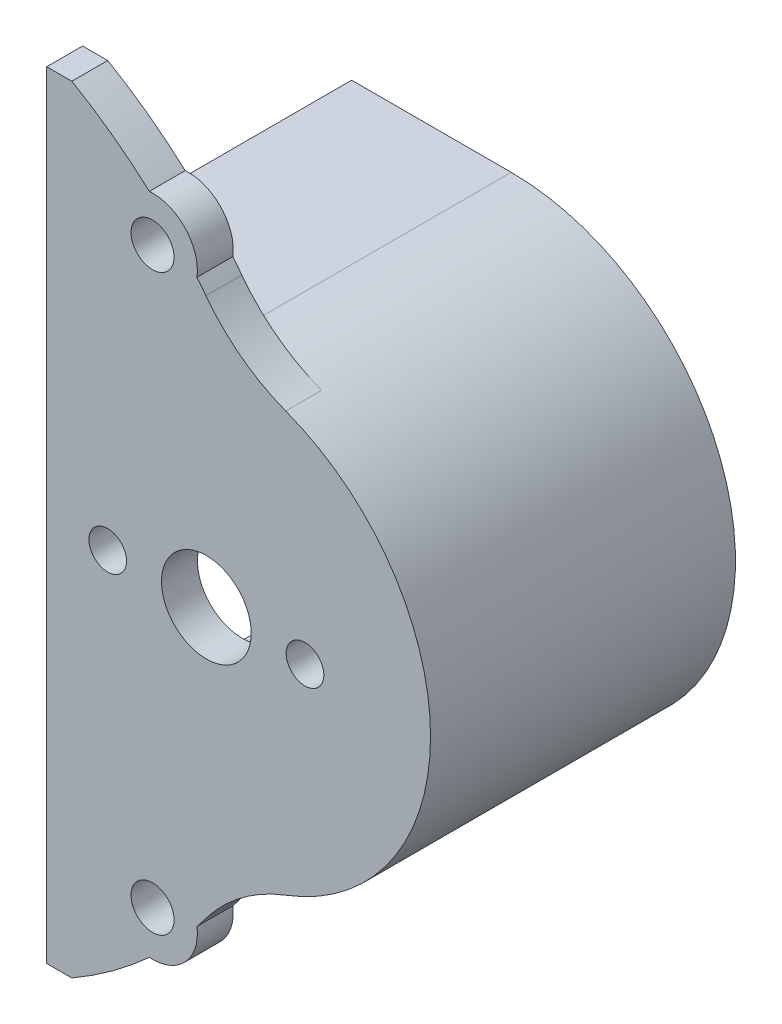
ISO-10303-21;
HEADER;
FILE_DESCRIPTION(('STEP AP214'),'2;1');
FILE_NAME('part.step','',(''),(''),'','','');
FILE_SCHEMA(('AUTOMOTIVE_DESIGN { 1 0 10303 214 1 1 1 1 }'));
ENDSEC;
DATA;
#1=APPLICATION_CONTEXT('core data for automotive mechanical design processes');
#2=APPLICATION_PROTOCOL_DEFINITION('international standard','automotive_design',2000,#1);
#3=PRODUCT_CONTEXT('',#1,'mechanical');
#4=PRODUCT('Part','Part','',(#3));
#5=PRODUCT_RELATED_PRODUCT_CATEGORY('part','',(#4));
#6=PRODUCT_DEFINITION_FORMATION('','',#4);
#7=PRODUCT_DEFINITION_CONTEXT('part definition',#1,'design');
#8=PRODUCT_DEFINITION('design','',#6,#7);
#9=PRODUCT_DEFINITION_SHAPE('','',#8);
#10=(LENGTH_UNIT() NAMED_UNIT(*) SI_UNIT(.MILLI.,.METRE.));
#11=(NAMED_UNIT(*) PLANE_ANGLE_UNIT() SI_UNIT($,.RADIAN.));
#12=(NAMED_UNIT(*) SI_UNIT($,.STERADIAN.) SOLID_ANGLE_UNIT());
#13=UNCERTAINTY_MEASURE_WITH_UNIT(LENGTH_MEASURE(1.E-05),#10,'distance_accuracy_value','');
#14=(GEOMETRIC_REPRESENTATION_CONTEXT(3) GLOBAL_UNCERTAINTY_ASSIGNED_CONTEXT((#13)) GLOBAL_UNIT_ASSIGNED_CONTEXT((#10,
#11,#12)) REPRESENTATION_CONTEXT('',''));
#15=CARTESIAN_POINT('',(0.,0.,0.));
#16=DIRECTION('',(0.,0.,1.));
#17=DIRECTION('',(1.,0.,0.));
#18=AXIS2_PLACEMENT_3D('',#15,#16,#17);
#19=CARTESIAN_POINT('',(8.6602540378444,4.99999999999998,0.));
#20=DIRECTION('',(0.,0.,1.));
#21=DIRECTION('',(1.,0.,0.));
#22=AXIS2_PLACEMENT_3D('',#19,#20,#21);
#23=PLANE('',#22);
#24=CARTESIAN_POINT('',(-3.00000000000013,4.00000000000007,0.));
#25=DIRECTION('',(0.,0.,1.));
#26=DIRECTION('',(1.,0.,0.));
#27=AXIS2_PLACEMENT_3D('',#24,#25,#26);
#28=CIRCLE('',#27,1.20000000000005);
#29=CARTESIAN_POINT('',(-1.80000000000008,4.00000000000007,0.));
#30=VERTEX_POINT('',#29);
#31=EDGE_CURVE('E322',#30,#30,#28,.T.);
#32=ORIENTED_EDGE('',*,*,#31,.T.);
#33=EDGE_LOOP('',(#32));
#34=FACE_BOUND('',#33,.T.);
#35=DIRECTION('',(-1.,0.,0.));
#36=VECTOR('',#35,1.);
#37=CARTESIAN_POINT('',(0.,7.5,0.));
#38=LINE('',#37,#36);
#39=CARTESIAN_POINT('',(0.,7.5,0.));
#40=VERTEX_POINT('',#39);
#41=CARTESIAN_POINT('',(-8.9,7.5,0.));
#42=VERTEX_POINT('',#41);
#43=EDGE_CURVE('E199',#40,#42,#38,.T.);
#44=ORIENTED_EDGE('',*,*,#43,.F.);
#45=CARTESIAN_POINT('',(0.,20.,0.));
#46=DIRECTION('',(0.,0.,-1.));
#47=DIRECTION('',(-1.,0.,0.));
#48=AXIS2_PLACEMENT_3D('',#45,#46,#47);
#49=CIRCLE('',#48,12.5);
#50=CARTESIAN_POINT('',(4.4270833333333,8.31022099611278,0.));
#51=VERTEX_POINT('',#50);
#52=EDGE_CURVE('E12',#51,#40,#49,.T.);
#53=ORIENTED_EDGE('',*,*,#52,.F.);
#54=CARTESIAN_POINT('',(7.96874999999996,-1.04160220699704,0.));
#55=DIRECTION('',(0.,0.,1.));
#56=DIRECTION('',(1.,0.,0.));
#57=AXIS2_PLACEMENT_3D('',#54,#55,#56);
#58=CIRCLE('',#57,10.);
#59=CARTESIAN_POINT('',(-0.0223214285714549,4.97028413785925,0.));
#60=VERTEX_POINT('',#59);
#61=EDGE_CURVE('E350',#60,#51,#58,.F.);
#62=ORIENTED_EDGE('',*,*,#61,.F.);
#63=CARTESIAN_POINT('',(-20.,20.,0.));
#64=DIRECTION('',(0.,0.,1.));
#65=DIRECTION('',(1.,0.,0.));
#66=AXIS2_PLACEMENT_3D('',#63,#64,#65);
#67=CIRCLE('',#66,25.);
#68=CARTESIAN_POINT('',(-0.521680060242404,4.32852743599242,0.));
#69=VERTEX_POINT('',#68);
#70=EDGE_CURVE('E348',#69,#60,#67,.T.);
#71=ORIENTED_EDGE('',*,*,#70,.F.);
#72=CARTESIAN_POINT('',(-3.00000000000003,3.99999999999996,0.));
#73=DIRECTION('',(0.,0.,1.));
#74=DIRECTION('',(1.,0.,0.));
#75=AXIS2_PLACEMENT_3D('',#72,#73,#74);
#76=CIRCLE('',#75,2.5);
#77=CARTESIAN_POINT('',(-3.17786122416133,1.50633494932859,0.));
#78=VERTEX_POINT('',#77);
#79=EDGE_CURVE('E346',#78,#69,#76,.T.);
#80=ORIENTED_EDGE('',*,*,#79,.F.);
#81=CARTESIAN_POINT('',(-20.,20.,0.));
#82=DIRECTION('',(0.,0.,1.));
#83=DIRECTION('',(1.,0.,0.));
#84=AXIS2_PLACEMENT_3D('',#81,#82,#83);
#85=CIRCLE('',#84,25.);
#86=CARTESIAN_POINT('',(-7.49999999999999,-1.65063509461098,0.));
#87=VERTEX_POINT('',#86);
#88=EDGE_CURVE('E310',#87,#78,#85,.T.);
#89=ORIENTED_EDGE('',*,*,#88,.F.);
#90=DIRECTION('',(1.,0.,0.));
#91=VECTOR('',#90,1.);
#92=CARTESIAN_POINT('',(-8.9,-1.65063509461098,0.));
#93=LINE('',#92,#91);
#94=CARTESIAN_POINT('',(-8.9,-1.65063509461098,0.));
#95=VERTEX_POINT('',#94);
#96=EDGE_CURVE('E257',#95,#87,#93,.T.);
#97=ORIENTED_EDGE('',*,*,#96,.F.);
#98=DIRECTION('',(0.,-1.,0.));
#99=VECTOR('',#98,1.);
#100=CARTESIAN_POINT('',(-8.9,41.6506350946109,0.));
#101=LINE('',#100,#99);
#102=EDGE_CURVE('E253',#42,#95,#101,.T.);
#103=ORIENTED_EDGE('',*,*,#102,.F.);
#104=EDGE_LOOP('',(#44,#53,#62,#71,#80,#89,#97,#103));
#105=FACE_BOUND('',#104,.T.);
#106=ADVANCED_FACE('F43',(#34,#105),#23,.F.);
#107=CARTESIAN_POINT('',(-3.00000000000002,35.9999999999999,0.));
#108=DIRECTION('',(0.,0.,1.));
#109=DIRECTION('',(1.,0.,0.));
#110=AXIS2_PLACEMENT_3D('',#107,#108,#109);
#111=CIRCLE('',#110,1.2);
#112=CARTESIAN_POINT('',(-1.80000000000002,35.9999999999999,0.));
#113=VERTEX_POINT('',#112);
#114=EDGE_CURVE('E315',#113,#113,#111,.T.);
#115=ORIENTED_EDGE('',*,*,#114,.T.);
#116=EDGE_LOOP('',(#115));
#117=FACE_BOUND('',#116,.T.);
#118=CARTESIAN_POINT('',(0.,32.5,0.));
#119=VERTEX_POINT('',#118);
#120=CARTESIAN_POINT('',(4.42708333333335,31.6897790038872,0.));
#121=VERTEX_POINT('',#120);
#122=EDGE_CURVE('E53',#119,#121,#49,.T.);
#123=ORIENTED_EDGE('',*,*,#122,.F.);
#124=DIRECTION('',(1.,0.,0.));
#125=VECTOR('',#124,1.);
#126=CARTESIAN_POINT('',(0.,32.5,0.));
#127=LINE('',#126,#125);
#128=CARTESIAN_POINT('',(-8.9,32.5,0.));
#129=VERTEX_POINT('',#128);
#130=EDGE_CURVE('E233',#129,#119,#127,.T.);
#131=ORIENTED_EDGE('',*,*,#130,.F.);
#132=CARTESIAN_POINT('',(-8.9,41.6506350946109,0.));
#133=VERTEX_POINT('',#132);
#134=EDGE_CURVE('E254',#133,#129,#101,.T.);
#135=ORIENTED_EDGE('',*,*,#134,.F.);
#136=DIRECTION('',(1.,0.,0.));
#137=VECTOR('',#136,1.);
#138=CARTESIAN_POINT('',(-8.9,41.6506350946109,0.));
#139=LINE('',#138,#137);
#140=CARTESIAN_POINT('',(-7.49999999999999,41.6506350946109,0.));
#141=VERTEX_POINT('',#140);
#142=EDGE_CURVE('E260',#133,#141,#139,.T.);
#143=ORIENTED_EDGE('',*,*,#142,.T.);
#144=CARTESIAN_POINT('',(-3.17786122416126,38.4936650506713,0.));
#145=VERTEX_POINT('',#144);
#146=EDGE_CURVE('E292',#145,#141,#85,.T.);
#147=ORIENTED_EDGE('',*,*,#146,.F.);
#148=CARTESIAN_POINT('',(-2.99999999999998,36.,0.));
#149=DIRECTION('',(0.,0.,1.));
#150=DIRECTION('',(1.,0.,0.));
#151=AXIS2_PLACEMENT_3D('',#148,#149,#150);
#152=CIRCLE('',#151,2.49999999999999);
#153=CARTESIAN_POINT('',(-0.52168006024237,35.6714725640075,0.));
#154=VERTEX_POINT('',#153);
#155=EDGE_CURVE('E353',#154,#145,#152,.T.);
#156=ORIENTED_EDGE('',*,*,#155,.F.);
#157=CARTESIAN_POINT('',(-20.,20.,0.));
#158=DIRECTION('',(0.,0.,1.));
#159=DIRECTION('',(1.,0.,0.));
#160=AXIS2_PLACEMENT_3D('',#157,#158,#159);
#161=CIRCLE('',#160,25.);
#162=CARTESIAN_POINT('',(-0.0223214285714167,35.0297158621407,0.));
#163=VERTEX_POINT('',#162);
#164=EDGE_CURVE('E354',#163,#154,#161,.T.);
#165=ORIENTED_EDGE('',*,*,#164,.F.);
#166=CARTESIAN_POINT('',(7.96875000000002,41.0416022069969,0.));
#167=DIRECTION('',(0.,0.,1.));
#168=DIRECTION('',(1.,0.,0.));
#169=AXIS2_PLACEMENT_3D('',#166,#167,#168);
#170=CIRCLE('',#169,10.);
#171=EDGE_CURVE('E47',#121,#163,#170,.F.);
#172=ORIENTED_EDGE('',*,*,#171,.F.);
#173=EDGE_LOOP('',(#123,#131,#135,#143,#147,#156,#165,#172));
#174=FACE_BOUND('',#173,.T.);
#175=ADVANCED_FACE('F369',(#117,#174),#23,.F.);
#176=CARTESIAN_POINT('',(8.6602540378444,4.99999999999998,2.));
#177=DIRECTION('',(0.,0.,1.));
#178=DIRECTION('',(1.,0.,0.));
#179=AXIS2_PLACEMENT_3D('',#176,#177,#178);
#180=PLANE('',#179);
#181=CARTESIAN_POINT('',(-20.,20.,2.));
#182=DIRECTION('',(0.,0.,1.));
#183=DIRECTION('',(1.,0.,0.));
#184=AXIS2_PLACEMENT_3D('',#181,#182,#183);
#185=CIRCLE('',#184,25.);
#186=CARTESIAN_POINT('',(-3.17786122416126,38.4936650506713,2.));
#187=VERTEX_POINT('',#186);
#188=CARTESIAN_POINT('',(-7.49999999999999,41.6506350946109,2.));
#189=VERTEX_POINT('',#188);
#190=EDGE_CURVE('E271',#187,#189,#185,.T.);
#191=ORIENTED_EDGE('',*,*,#190,.T.);
#192=DIRECTION('',(1.,0.,0.));
#193=VECTOR('',#192,1.);
#194=CARTESIAN_POINT('',(-8.9,41.6506350946109,2.));
#195=LINE('',#194,#193);
#196=CARTESIAN_POINT('',(-8.9,41.6506350946109,2.));
#197=VERTEX_POINT('',#196);
#198=EDGE_CURVE('E263',#197,#189,#195,.T.);
#199=ORIENTED_EDGE('',*,*,#198,.F.);
#200=DIRECTION('',(0.,1.,0.));
#201=VECTOR('',#200,1.);
#202=CARTESIAN_POINT('',(-8.9,-1.65063509461098,2.));
#203=LINE('',#202,#201);
#204=CARTESIAN_POINT('',(-8.9,-1.65063509461098,2.));
#205=VERTEX_POINT('',#204);
#206=EDGE_CURVE('E249',#205,#197,#203,.T.);
#207=ORIENTED_EDGE('',*,*,#206,.F.);
#208=DIRECTION('',(1.,0.,0.));
#209=VECTOR('',#208,1.);
#210=CARTESIAN_POINT('',(-8.9,-1.65063509461098,2.));
#211=LINE('',#210,#209);
#212=CARTESIAN_POINT('',(-7.5,-1.65063509461098,2.));
#213=VERTEX_POINT('',#212);
#214=EDGE_CURVE('E265',#205,#213,#211,.T.);
#215=ORIENTED_EDGE('',*,*,#214,.T.);
#216=CARTESIAN_POINT('',(-3.17786122416133,1.50633494932859,2.));
#217=VERTEX_POINT('',#216);
#218=EDGE_CURVE('E270',#213,#217,#185,.T.);
#219=ORIENTED_EDGE('',*,*,#218,.T.);
#220=CARTESIAN_POINT('',(-3.00000000000003,3.99999999999996,2.));
#221=DIRECTION('',(0.,0.,1.));
#222=DIRECTION('',(1.,0.,0.));
#223=AXIS2_PLACEMENT_3D('',#220,#221,#222);
#224=CIRCLE('',#223,2.5);
#225=CARTESIAN_POINT('',(-0.521680060242404,4.32852743599242,2.));
#226=VERTEX_POINT('',#225);
#227=EDGE_CURVE('E274',#217,#226,#224,.T.);
#228=ORIENTED_EDGE('',*,*,#227,.T.);
#229=CARTESIAN_POINT('',(-20.,20.,2.));
#230=DIRECTION('',(0.,0.,1.));
#231=DIRECTION('',(1.,0.,0.));
#232=AXIS2_PLACEMENT_3D('',#229,#230,#231);
#233=CIRCLE('',#232,25.);
#234=CARTESIAN_POINT('',(-0.0223214285714549,4.97028413785925,2.));
#235=VERTEX_POINT('',#234);
#236=EDGE_CURVE('E277',#226,#235,#233,.T.);
#237=ORIENTED_EDGE('',*,*,#236,.T.);
#238=CARTESIAN_POINT('',(7.96874999999996,-1.04160220699704,2.));
#239=DIRECTION('',(0.,0.,-1.));
#240=DIRECTION('',(1.,0.,0.));
#241=AXIS2_PLACEMENT_3D('',#238,#239,#240);
#242=CIRCLE('',#241,10.);
#243=CARTESIAN_POINT('',(4.4270833333333,8.31022099611274,2.));
#244=VERTEX_POINT('',#243);
#245=EDGE_CURVE('E280',#235,#244,#242,.T.);
#246=ORIENTED_EDGE('',*,*,#245,.T.);
#247=CARTESIAN_POINT('',(0.,20.,2.));
#248=DIRECTION('',(0.,0.,1.));
#249=DIRECTION('',(1.,0.,0.));
#250=AXIS2_PLACEMENT_3D('',#247,#248,#249);
#251=CIRCLE('',#250,12.5);
#252=CARTESIAN_POINT('',(4.42708333333334,31.6897790038872,2.));
#253=VERTEX_POINT('',#252);
#254=EDGE_CURVE('E319',#244,#253,#251,.T.);
#255=ORIENTED_EDGE('',*,*,#254,.T.);
#256=CARTESIAN_POINT('',(7.96875000000002,41.0416022069969,2.));
#257=DIRECTION('',(0.,0.,-1.));
#258=DIRECTION('',(1.,0.,0.));
#259=AXIS2_PLACEMENT_3D('',#256,#257,#258);
#260=CIRCLE('',#259,10.);
#261=CARTESIAN_POINT('',(-0.0223214285714167,35.0297158621407,2.));
#262=VERTEX_POINT('',#261);
#263=EDGE_CURVE('E283',#253,#262,#260,.T.);
#264=ORIENTED_EDGE('',*,*,#263,.T.);
#265=CARTESIAN_POINT('',(-20.,20.,2.));
#266=DIRECTION('',(0.,0.,1.));
#267=DIRECTION('',(1.,0.,0.));
#268=AXIS2_PLACEMENT_3D('',#265,#266,#267);
#269=CIRCLE('',#268,25.);
#270=CARTESIAN_POINT('',(-0.52168006024237,35.6714725640075,2.));
#271=VERTEX_POINT('',#270);
#272=EDGE_CURVE('E286',#262,#271,#269,.T.);
#273=ORIENTED_EDGE('',*,*,#272,.T.);
#274=CARTESIAN_POINT('',(-2.99999999999998,36.,2.));
#275=DIRECTION('',(0.,0.,1.));
#276=DIRECTION('',(1.,0.,0.));
#277=AXIS2_PLACEMENT_3D('',#274,#275,#276);
#278=CIRCLE('',#277,2.49999999999999);
#279=EDGE_CURVE('E267',#271,#187,#278,.T.);
#280=ORIENTED_EDGE('',*,*,#279,.T.);
#281=EDGE_LOOP('',(#191,#199,#207,#215,#219,#228,#237,#246,#255,#264,#273,#280));
#282=FACE_BOUND('',#281,.T.);
#283=CARTESIAN_POINT('',(-3.00000000000013,4.00000000000007,2.));
#284=DIRECTION('',(0.,0.,1.));
#285=DIRECTION('',(1.,0.,0.));
#286=AXIS2_PLACEMENT_3D('',#283,#284,#285);
#287=CIRCLE('',#286,1.20000000000005);
#288=CARTESIAN_POINT('',(-1.80000000000008,4.00000000000007,2.));
#289=VERTEX_POINT('',#288);
#290=EDGE_CURVE('E312',#289,#289,#287,.T.);
#291=ORIENTED_EDGE('',*,*,#290,.F.);
#292=EDGE_LOOP('',(#291));
#293=FACE_BOUND('',#292,.T.);
#294=CARTESIAN_POINT('',(-3.00000000000002,35.9999999999999,2.));
#295=DIRECTION('',(0.,0.,1.));
#296=DIRECTION('',(1.,0.,0.));
#297=AXIS2_PLACEMENT_3D('',#294,#295,#296);
#298=CIRCLE('',#297,1.2);
#299=CARTESIAN_POINT('',(-1.80000000000002,35.9999999999999,2.));
#300=VERTEX_POINT('',#299);
#301=EDGE_CURVE('E316',#300,#300,#298,.T.);
#302=ORIENTED_EDGE('',*,*,#301,.F.);
#303=EDGE_LOOP('',(#302));
#304=FACE_BOUND('',#303,.T.);
#305=CARTESIAN_POINT('',(5.5,20.,2.));
#306=DIRECTION('',(0.,0.,1.));
#307=DIRECTION('',(1.,0.,0.));
#308=AXIS2_PLACEMENT_3D('',#305,#306,#307);
#309=CIRCLE('',#308,1.05);
#310=CARTESIAN_POINT('',(6.55,20.,2.));
#311=VERTEX_POINT('',#310);
#312=EDGE_CURVE('E321',#311,#311,#309,.T.);
#313=ORIENTED_EDGE('',*,*,#312,.F.);
#314=EDGE_LOOP('',(#313));
#315=FACE_BOUND('',#314,.T.);
#316=CARTESIAN_POINT('',(-5.5,20.,2.));
#317=DIRECTION('',(0.,0.,1.));
#318=DIRECTION('',(1.,0.,0.));
#319=AXIS2_PLACEMENT_3D('',#316,#317,#318);
#320=CIRCLE('',#319,1.05);
#321=CARTESIAN_POINT('',(-4.45,20.,2.));
#322=VERTEX_POINT('',#321);
#323=EDGE_CURVE('E323',#322,#322,#320,.T.);
#324=ORIENTED_EDGE('',*,*,#323,.F.);
#325=EDGE_LOOP('',(#324));
#326=FACE_BOUND('',#325,.T.);
#327=CARTESIAN_POINT('',(0.,20.,2.));
#328=DIRECTION('',(0.,0.,1.));
#329=DIRECTION('',(1.,0.,0.));
#330=AXIS2_PLACEMENT_3D('',#327,#328,#329);
#331=CIRCLE('',#330,2.5);
#332=CARTESIAN_POINT('',(2.5,20.,2.));
#333=VERTEX_POINT('',#332);
#334=EDGE_CURVE('E326',#333,#333,#331,.T.);
#335=ORIENTED_EDGE('',*,*,#334,.F.);
#336=EDGE_LOOP('',(#335));
#337=FACE_BOUND('',#336,.T.);
#338=ADVANCED_FACE('F381',(#282,#293,#304,#315,#326,#337),#180,.T.);
#339=CARTESIAN_POINT('',(5.5,20.,0.));
#340=DIRECTION('',(0.,0.,1.));
#341=DIRECTION('',(1.,0.,0.));
#342=AXIS2_PLACEMENT_3D('',#339,#340,#341);
#343=CIRCLE('',#342,1.05);
#344=CARTESIAN_POINT('',(6.55,20.,0.));
#345=VERTEX_POINT('',#344);
#346=EDGE_CURVE('E337',#345,#345,#343,.T.);
#347=ORIENTED_EDGE('',*,*,#346,.T.);
#348=EDGE_LOOP('',(#347));
#349=FACE_BOUND('',#348,.T.);
#350=CARTESIAN_POINT('',(-5.5,20.,0.));
#351=DIRECTION('',(0.,0.,1.));
#352=DIRECTION('',(1.,0.,0.));
#353=AXIS2_PLACEMENT_3D('',#350,#351,#352);
#354=CIRCLE('',#353,1.05);
#355=CARTESIAN_POINT('',(-4.45,20.,0.));
#356=VERTEX_POINT('',#355);
#357=EDGE_CURVE('E334',#356,#356,#354,.T.);
#358=ORIENTED_EDGE('',*,*,#357,.T.);
#359=EDGE_LOOP('',(#358));
#360=FACE_BOUND('',#359,.T.);
#361=CARTESIAN_POINT('',(0.,20.,0.));
#362=DIRECTION('',(0.,0.,1.));
#363=DIRECTION('',(1.,0.,0.));
#364=AXIS2_PLACEMENT_3D('',#361,#362,#363);
#365=CIRCLE('',#364,2.5);
#366=CARTESIAN_POINT('',(2.5,20.,0.));
#367=VERTEX_POINT('',#366);
#368=EDGE_CURVE('E331',#367,#367,#365,.T.);
#369=ORIENTED_EDGE('',*,*,#368,.T.);
#370=EDGE_LOOP('',(#369));
#371=FACE_BOUND('',#370,.T.);
#372=CARTESIAN_POINT('',(-8.9,31.5,0.));
#373=VERTEX_POINT('',#372);
#374=CARTESIAN_POINT('',(-8.9,8.49999999999999,0.));
#375=VERTEX_POINT('',#374);
#376=EDGE_CURVE('E258',#373,#375,#101,.T.);
#377=ORIENTED_EDGE('',*,*,#376,.F.);
#378=DIRECTION('',(-1.,0.,0.));
#379=VECTOR('',#378,1.);
#380=CARTESIAN_POINT('',(0.,31.5,0.));
#381=LINE('',#380,#379);
#382=CARTESIAN_POINT('',(0.,31.5,0.));
#383=VERTEX_POINT('',#382);
#384=EDGE_CURVE('E230',#373,#383,#381,.F.);
#385=ORIENTED_EDGE('',*,*,#384,.T.);
#386=CARTESIAN_POINT('',(0.,20.,0.));
#387=DIRECTION('',(0.,0.,-1.));
#388=DIRECTION('',(-1.,0.,0.));
#389=AXIS2_PLACEMENT_3D('',#386,#387,#388);
#390=CIRCLE('',#389,11.5);
#391=CARTESIAN_POINT('',(0.,8.5,0.));
#392=VERTEX_POINT('',#391);
#393=EDGE_CURVE('E227',#383,#392,#390,.T.);
#394=ORIENTED_EDGE('',*,*,#393,.T.);
#395=DIRECTION('',(-1.,0.,0.));
#396=VECTOR('',#395,1.);
#397=CARTESIAN_POINT('',(0.,8.5,0.));
#398=LINE('',#397,#396);
#399=EDGE_CURVE('E225',#392,#375,#398,.T.);
#400=ORIENTED_EDGE('',*,*,#399,.T.);
#401=EDGE_LOOP('',(#377,#385,#394,#400));
#402=FACE_BOUND('',#401,.T.);
#403=ADVANCED_FACE('F45',(#349,#360,#371,#402),#23,.F.);
#404=CARTESIAN_POINT('',(0.,20.,-3.));
#405=DIRECTION('',(0.,0.,1.));
#406=DIRECTION('',(1.,0.,0.));
#407=AXIS2_PLACEMENT_3D('',#404,#405,#406);
#408=CYLINDRICAL_SURFACE('',#407,2.5);
#409=ORIENTED_EDGE('',*,*,#334,.T.);
#410=EDGE_LOOP('',(#409));
#411=FACE_BOUND('',#410,.T.);
#412=ORIENTED_EDGE('',*,*,#368,.F.);
#413=EDGE_LOOP('',(#412));
#414=FACE_BOUND('',#413,.T.);
#415=ADVANCED_FACE('F421',(#411,#414),#408,.F.);
#416=CARTESIAN_POINT('',(-5.5,20.,-3.));
#417=DIRECTION('',(0.,0.,1.));
#418=DIRECTION('',(1.,0.,0.));
#419=AXIS2_PLACEMENT_3D('',#416,#417,#418);
#420=CYLINDRICAL_SURFACE('',#419,1.05);
#421=ORIENTED_EDGE('',*,*,#323,.T.);
#422=EDGE_LOOP('',(#421));
#423=FACE_BOUND('',#422,.T.);
#424=ORIENTED_EDGE('',*,*,#357,.F.);
#425=EDGE_LOOP('',(#424));
#426=FACE_BOUND('',#425,.T.);
#427=ADVANCED_FACE('F427',(#423,#426),#420,.F.);
#428=CARTESIAN_POINT('',(5.5,20.,-3.));
#429=DIRECTION('',(0.,0.,1.));
#430=DIRECTION('',(1.,0.,0.));
#431=AXIS2_PLACEMENT_3D('',#428,#429,#430);
#432=CYLINDRICAL_SURFACE('',#431,1.05);
#433=ORIENTED_EDGE('',*,*,#312,.T.);
#434=EDGE_LOOP('',(#433));
#435=FACE_BOUND('',#434,.T.);
#436=ORIENTED_EDGE('',*,*,#346,.F.);
#437=EDGE_LOOP('',(#436));
#438=FACE_BOUND('',#437,.T.);
#439=ADVANCED_FACE('F523',(#435,#438),#432,.F.);
#440=CARTESIAN_POINT('',(0.,20.,-27.0077571322111));
#441=DIRECTION('',(0.,0.,1.));
#442=DIRECTION('',(1.,0.,0.));
#443=AXIS2_PLACEMENT_3D('',#440,#441,#442);
#444=CYLINDRICAL_SURFACE('',#443,12.5);
#445=DIRECTION('',(0.,0.,1.));
#446=VECTOR('',#445,1.);
#447=CARTESIAN_POINT('',(4.4270833333333,8.31022099611274,-12.));
#448=LINE('',#447,#446);
#449=EDGE_CURVE('E298',#51,#244,#448,.T.);
#450=ORIENTED_EDGE('',*,*,#449,.F.);
#451=ORIENTED_EDGE('',*,*,#52,.T.);
#452=DIRECTION('',(0.,0.,1.));
#453=VECTOR('',#452,1.);
#454=CARTESIAN_POINT('',(0.,7.5,-15.));
#455=LINE('',#454,#453);
#456=CARTESIAN_POINT('',(0.,7.5,-15.));
#457=VERTEX_POINT('',#456);
#458=EDGE_CURVE('E223',#457,#40,#455,.T.);
#459=ORIENTED_EDGE('',*,*,#458,.F.);
#460=CARTESIAN_POINT('',(0.,20.,-15.));
#461=DIRECTION('',(0.,0.,-1.));
#462=DIRECTION('',(-1.,0.,0.));
#463=AXIS2_PLACEMENT_3D('',#460,#461,#462);
#464=CIRCLE('',#463,12.5);
#465=CARTESIAN_POINT('',(0.,32.5,-15.));
#466=VERTEX_POINT('',#465);
#467=EDGE_CURVE('E190',#466,#457,#464,.T.);
#468=ORIENTED_EDGE('',*,*,#467,.F.);
#469=DIRECTION('',(0.,0.,1.));
#470=VECTOR('',#469,1.);
#471=CARTESIAN_POINT('',(0.,32.5,-15.));
#472=LINE('',#471,#470);
#473=EDGE_CURVE('E236',#466,#119,#472,.T.);
#474=ORIENTED_EDGE('',*,*,#473,.T.);
#475=ORIENTED_EDGE('',*,*,#122,.T.);
#476=DIRECTION('',(0.,0.,1.));
#477=VECTOR('',#476,1.);
#478=CARTESIAN_POINT('',(4.42708333333334,31.6897790038872,-12.));
#479=LINE('',#478,#477);
#480=EDGE_CURVE('E295',#121,#253,#479,.T.);
#481=ORIENTED_EDGE('',*,*,#480,.T.);
#482=ORIENTED_EDGE('',*,*,#254,.F.);
#483=EDGE_LOOP('',(#450,#451,#459,#468,#474,#475,#481,#482));
#484=FACE_BOUND('',#483,.T.);
#485=ADVANCED_FACE('F386',(#484),#444,.T.);
#486=CARTESIAN_POINT('',(-3.00000000000002,35.9999999999999,-8.));
#487=DIRECTION('',(0.,0.,1.));
#488=DIRECTION('',(1.,0.,0.));
#489=AXIS2_PLACEMENT_3D('',#486,#487,#488);
#490=CYLINDRICAL_SURFACE('',#489,1.2);
#491=ORIENTED_EDGE('',*,*,#301,.T.);
#492=EDGE_LOOP('',(#491));
#493=FACE_BOUND('',#492,.T.);
#494=ORIENTED_EDGE('',*,*,#114,.F.);
#495=EDGE_LOOP('',(#494));
#496=FACE_BOUND('',#495,.T.);
#497=ADVANCED_FACE('F522',(#493,#496),#490,.F.);
#498=CARTESIAN_POINT('',(-3.00000000000013,4.00000000000007,-8.));
#499=DIRECTION('',(0.,0.,1.));
#500=DIRECTION('',(1.,0.,0.));
#501=AXIS2_PLACEMENT_3D('',#498,#499,#500);
#502=CYLINDRICAL_SURFACE('',#501,1.20000000000005);
#503=ORIENTED_EDGE('',*,*,#290,.T.);
#504=EDGE_LOOP('',(#503));
#505=FACE_BOUND('',#504,.T.);
#506=ORIENTED_EDGE('',*,*,#31,.F.);
#507=EDGE_LOOP('',(#506));
#508=FACE_BOUND('',#507,.T.);
#509=ADVANCED_FACE('F578',(#505,#508),#502,.F.);
#510=CARTESIAN_POINT('',(-20.,20.,-12.));
#511=DIRECTION('',(0.,0.,1.));
#512=DIRECTION('',(1.,0.,0.));
#513=AXIS2_PLACEMENT_3D('',#510,#511,#512);
#514=CYLINDRICAL_SURFACE('',#513,25.);
#515=ORIENTED_EDGE('',*,*,#146,.T.);
#516=DIRECTION('',(0.,0.,1.));
#517=VECTOR('',#516,1.);
#518=CARTESIAN_POINT('',(-7.5,41.6506350946109,-12.));
#519=LINE('',#518,#517);
#520=EDGE_CURVE('E340',#189,#141,#519,.F.);
#521=ORIENTED_EDGE('',*,*,#520,.F.);
#522=ORIENTED_EDGE('',*,*,#190,.F.);
#523=DIRECTION('',(0.,0.,1.));
#524=VECTOR('',#523,1.);
#525=CARTESIAN_POINT('',(-3.17786122416126,38.4936650506713,-12.));
#526=LINE('',#525,#524);
#527=EDGE_CURVE('E289',#145,#187,#526,.T.);
#528=ORIENTED_EDGE('',*,*,#527,.F.);
#529=EDGE_LOOP('',(#515,#521,#522,#528));
#530=FACE_BOUND('',#529,.T.);
#531=ADVANCED_FACE('F377',(#530),#514,.T.);
#532=CARTESIAN_POINT('',(7.96875000000002,41.0416022069969,-12.));
#533=DIRECTION('',(0.,0.,1.));
#534=DIRECTION('',(1.,0.,0.));
#535=AXIS2_PLACEMENT_3D('',#532,#533,#534);
#536=CYLINDRICAL_SURFACE('',#535,10.);
#537=ORIENTED_EDGE('',*,*,#171,.T.);
#538=DIRECTION('',(0.,0.,1.));
#539=VECTOR('',#538,1.);
#540=CARTESIAN_POINT('',(-0.0223214285714167,35.0297158621407,-12.));
#541=LINE('',#540,#539);
#542=EDGE_CURVE('E293',#163,#262,#541,.T.);
#543=ORIENTED_EDGE('',*,*,#542,.T.);
#544=ORIENTED_EDGE('',*,*,#263,.F.);
#545=ORIENTED_EDGE('',*,*,#480,.F.);
#546=EDGE_LOOP('',(#537,#543,#544,#545));
#547=FACE_BOUND('',#546,.T.);
#548=ADVANCED_FACE('F362',(#547),#536,.F.);
#549=CARTESIAN_POINT('',(-20.,20.,-12.));
#550=DIRECTION('',(0.,0.,1.));
#551=DIRECTION('',(1.,0.,0.));
#552=AXIS2_PLACEMENT_3D('',#549,#550,#551);
#553=CYLINDRICAL_SURFACE('',#552,25.);
#554=ORIENTED_EDGE('',*,*,#164,.T.);
#555=DIRECTION('',(0.,0.,1.));
#556=VECTOR('',#555,1.);
#557=CARTESIAN_POINT('',(-0.52168006024237,35.6714725640075,-12.));
#558=LINE('',#557,#556);
#559=EDGE_CURVE('E290',#154,#271,#558,.T.);
#560=ORIENTED_EDGE('',*,*,#559,.T.);
#561=ORIENTED_EDGE('',*,*,#272,.F.);
#562=ORIENTED_EDGE('',*,*,#542,.F.);
#563=EDGE_LOOP('',(#554,#560,#561,#562));
#564=FACE_BOUND('',#563,.T.);
#565=ADVANCED_FACE('F367',(#564),#553,.T.);
#566=CARTESIAN_POINT('',(-2.99999999999998,36.,-12.));
#567=DIRECTION('',(0.,0.,1.));
#568=DIRECTION('',(1.,0.,0.));
#569=AXIS2_PLACEMENT_3D('',#566,#567,#568);
#570=CYLINDRICAL_SURFACE('',#569,2.49999999999999);
#571=ORIENTED_EDGE('',*,*,#155,.T.);
#572=ORIENTED_EDGE('',*,*,#527,.T.);
#573=ORIENTED_EDGE('',*,*,#279,.F.);
#574=ORIENTED_EDGE('',*,*,#559,.F.);
#575=EDGE_LOOP('',(#571,#572,#573,#574));
#576=FACE_BOUND('',#575,.T.);
#577=ADVANCED_FACE('F373',(#576),#570,.T.);
#578=CARTESIAN_POINT('',(7.96874999999996,-1.04160220699704,-12.));
#579=DIRECTION('',(0.,0.,1.));
#580=DIRECTION('',(1.,0.,0.));
#581=AXIS2_PLACEMENT_3D('',#578,#579,#580);
#582=CYLINDRICAL_SURFACE('',#581,10.);
#583=ORIENTED_EDGE('',*,*,#61,.T.);
#584=ORIENTED_EDGE('',*,*,#449,.T.);
#585=ORIENTED_EDGE('',*,*,#245,.F.);
#586=DIRECTION('',(0.,0.,1.));
#587=VECTOR('',#586,1.);
#588=CARTESIAN_POINT('',(-0.0223214285714549,4.97028413785925,-12.));
#589=LINE('',#588,#587);
#590=EDGE_CURVE('E301',#60,#235,#589,.T.);
#591=ORIENTED_EDGE('',*,*,#590,.F.);
#592=EDGE_LOOP('',(#583,#584,#585,#591));
#593=FACE_BOUND('',#592,.T.);
#594=ADVANCED_FACE('F600',(#593),#582,.F.);
#595=CARTESIAN_POINT('',(-20.,20.,-12.));
#596=DIRECTION('',(0.,0.,1.));
#597=DIRECTION('',(1.,0.,0.));
#598=AXIS2_PLACEMENT_3D('',#595,#596,#597);
#599=CYLINDRICAL_SURFACE('',#598,25.);
#600=ORIENTED_EDGE('',*,*,#70,.T.);
#601=ORIENTED_EDGE('',*,*,#590,.T.);
#602=ORIENTED_EDGE('',*,*,#236,.F.);
#603=DIRECTION('',(0.,0.,1.));
#604=VECTOR('',#603,1.);
#605=CARTESIAN_POINT('',(-0.521680060242404,4.32852743599242,-12.));
#606=LINE('',#605,#604);
#607=EDGE_CURVE('E303',#69,#226,#606,.T.);
#608=ORIENTED_EDGE('',*,*,#607,.F.);
#609=EDGE_LOOP('',(#600,#601,#602,#608));
#610=FACE_BOUND('',#609,.T.);
#611=ADVANCED_FACE('F590',(#610),#599,.T.);
#612=CARTESIAN_POINT('',(-3.00000000000003,3.99999999999996,-12.));
#613=DIRECTION('',(0.,0.,1.));
#614=DIRECTION('',(1.,0.,0.));
#615=AXIS2_PLACEMENT_3D('',#612,#613,#614);
#616=CYLINDRICAL_SURFACE('',#615,2.5);
#617=ORIENTED_EDGE('',*,*,#79,.T.);
#618=ORIENTED_EDGE('',*,*,#607,.T.);
#619=ORIENTED_EDGE('',*,*,#227,.F.);
#620=DIRECTION('',(0.,0.,1.));
#621=VECTOR('',#620,1.);
#622=CARTESIAN_POINT('',(-3.17786122416133,1.50633494932859,-12.));
#623=LINE('',#622,#621);
#624=EDGE_CURVE('E305',#78,#217,#623,.T.);
#625=ORIENTED_EDGE('',*,*,#624,.F.);
#626=EDGE_LOOP('',(#617,#618,#619,#625));
#627=FACE_BOUND('',#626,.T.);
#628=ADVANCED_FACE('F409',(#627),#616,.T.);
#629=ORIENTED_EDGE('',*,*,#88,.T.);
#630=ORIENTED_EDGE('',*,*,#624,.T.);
#631=ORIENTED_EDGE('',*,*,#218,.F.);
#632=DIRECTION('',(0.,0.,1.));
#633=VECTOR('',#632,1.);
#634=CARTESIAN_POINT('',(-7.5,-1.65063509461098,-12.));
#635=LINE('',#634,#633);
#636=EDGE_CURVE('E68',#87,#213,#635,.T.);
#637=ORIENTED_EDGE('',*,*,#636,.F.);
#638=EDGE_LOOP('',(#629,#630,#631,#637));
#639=FACE_BOUND('',#638,.T.);
#640=ADVANCED_FACE('F402',(#639),#514,.T.);
#641=CARTESIAN_POINT('',(-8.9,-1.65063509461098,0.));
#642=DIRECTION('',(0.,1.,0.));
#643=DIRECTION('',(0.,0.,1.));
#644=AXIS2_PLACEMENT_3D('',#641,#642,#643);
#645=PLANE('',#644);
#646=ORIENTED_EDGE('',*,*,#636,.T.);
#647=ORIENTED_EDGE('',*,*,#214,.F.);
#648=DIRECTION('',(0.,0.,1.));
#649=VECTOR('',#648,1.);
#650=CARTESIAN_POINT('',(-8.9,-1.65063509461098,0.));
#651=LINE('',#650,#649);
#652=EDGE_CURVE('E202',#95,#205,#651,.T.);
#653=ORIENTED_EDGE('',*,*,#652,.F.);
#654=ORIENTED_EDGE('',*,*,#96,.T.);
#655=EDGE_LOOP('',(#646,#647,#653,#654));
#656=FACE_BOUND('',#655,.T.);
#657=ADVANCED_FACE('F400',(#656),#645,.F.);
#658=CARTESIAN_POINT('',(-8.9,41.6506350946109,2.));
#659=DIRECTION('',(0.,-1.,0.));
#660=DIRECTION('',(0.,0.,-1.));
#661=AXIS2_PLACEMENT_3D('',#658,#659,#660);
#662=PLANE('',#661);
#663=ORIENTED_EDGE('',*,*,#520,.T.);
#664=ORIENTED_EDGE('',*,*,#142,.F.);
#665=DIRECTION('',(0.,0.,-1.));
#666=VECTOR('',#665,1.);
#667=CARTESIAN_POINT('',(-8.9,41.6506350946109,2.));
#668=LINE('',#667,#666);
#669=EDGE_CURVE('E251',#197,#133,#668,.T.);
#670=ORIENTED_EDGE('',*,*,#669,.F.);
#671=ORIENTED_EDGE('',*,*,#198,.T.);
#672=EDGE_LOOP('',(#663,#664,#670,#671));
#673=FACE_BOUND('',#672,.T.);
#674=ADVANCED_FACE('F395',(#673),#662,.F.);
#675=CARTESIAN_POINT('',(-8.9,0.,0.));
#676=DIRECTION('',(-1.,0.,0.));
#677=DIRECTION('',(0.,0.,1.));
#678=AXIS2_PLACEMENT_3D('',#675,#676,#677);
#679=PLANE('',#678);
#680=ORIENTED_EDGE('',*,*,#652,.T.);
#681=ORIENTED_EDGE('',*,*,#206,.T.);
#682=ORIENTED_EDGE('',*,*,#669,.T.);
#683=ORIENTED_EDGE('',*,*,#134,.T.);
#684=DIRECTION('',(0.,0.,1.));
#685=VECTOR('',#684,1.);
#686=CARTESIAN_POINT('',(-8.9,32.5,-15.));
#687=LINE('',#686,#685);
#688=CARTESIAN_POINT('',(-8.9,32.5,-15.));
#689=VERTEX_POINT('',#688);
#690=EDGE_CURVE('E239',#689,#129,#687,.T.);
#691=ORIENTED_EDGE('',*,*,#690,.F.);
#692=DIRECTION('',(0.,-1.,0.));
#693=VECTOR('',#692,1.);
#694=CARTESIAN_POINT('',(-8.9,32.5,-15.));
#695=LINE('',#694,#693);
#696=CARTESIAN_POINT('',(-8.9,31.5,-15.));
#697=VERTEX_POINT('',#696);
#698=EDGE_CURVE('E217',#689,#697,#695,.T.);
#699=ORIENTED_EDGE('',*,*,#698,.T.);
#700=DIRECTION('',(0.,0.,1.));
#701=VECTOR('',#700,1.);
#702=CARTESIAN_POINT('',(-8.9,31.5,-15.));
#703=LINE('',#702,#701);
#704=EDGE_CURVE('E241',#697,#373,#703,.T.);
#705=ORIENTED_EDGE('',*,*,#704,.T.);
#706=ORIENTED_EDGE('',*,*,#376,.T.);
#707=DIRECTION('',(0.,0.,1.));
#708=VECTOR('',#707,1.);
#709=CARTESIAN_POINT('',(-8.9,8.5,-15.));
#710=LINE('',#709,#708);
#711=CARTESIAN_POINT('',(-8.9,8.5,-15.));
#712=VERTEX_POINT('',#711);
#713=EDGE_CURVE('E60',#712,#375,#710,.T.);
#714=ORIENTED_EDGE('',*,*,#713,.F.);
#715=DIRECTION('',(0.,-1.,0.));
#716=VECTOR('',#715,1.);
#717=CARTESIAN_POINT('',(-8.9,8.5,-15.));
#718=LINE('',#717,#716);
#719=CARTESIAN_POINT('',(-8.9,7.5,-15.));
#720=VERTEX_POINT('',#719);
#721=EDGE_CURVE('E188',#712,#720,#718,.T.);
#722=ORIENTED_EDGE('',*,*,#721,.T.);
#723=DIRECTION('',(0.,0.,1.));
#724=VECTOR('',#723,1.);
#725=CARTESIAN_POINT('',(-8.9,7.5,-15.));
#726=LINE('',#725,#724);
#727=EDGE_CURVE('E196',#720,#42,#726,.T.);
#728=ORIENTED_EDGE('',*,*,#727,.T.);
#729=ORIENTED_EDGE('',*,*,#102,.T.);
#730=EDGE_LOOP('',(#680,#681,#682,#683,#691,#699,#705,#706,#714,#722,#728,#729));
#731=FACE_BOUND('',#730,.T.);
#732=ADVANCED_FACE('F205',(#731),#679,.T.);
#733=CARTESIAN_POINT('',(0.,7.5,-15.));
#734=DIRECTION('',(0.,1.,0.));
#735=DIRECTION('',(-1.,0.,0.));
#736=AXIS2_PLACEMENT_3D('',#733,#734,#735);
#737=PLANE('',#736);
#738=ORIENTED_EDGE('',*,*,#43,.T.);
#739=ORIENTED_EDGE('',*,*,#727,.F.);
#740=DIRECTION('',(-1.,0.,0.));
#741=VECTOR('',#740,1.);
#742=CARTESIAN_POINT('',(0.,7.5,-15.));
#743=LINE('',#742,#741);
#744=EDGE_CURVE('E183',#457,#720,#743,.T.);
#745=ORIENTED_EDGE('',*,*,#744,.F.);
#746=ORIENTED_EDGE('',*,*,#458,.T.);
#747=EDGE_LOOP('',(#738,#739,#745,#746));
#748=FACE_BOUND('',#747,.T.);
#749=ADVANCED_FACE('F197',(#748),#737,.F.);
#750=CARTESIAN_POINT('',(0.,8.5,-15.));
#751=DIRECTION('',(0.,1.,0.));
#752=DIRECTION('',(-1.,0.,0.));
#753=AXIS2_PLACEMENT_3D('',#750,#751,#752);
#754=PLANE('',#753);
#755=ORIENTED_EDGE('',*,*,#399,.F.);
#756=DIRECTION('',(0.,0.,1.));
#757=VECTOR('',#756,1.);
#758=CARTESIAN_POINT('',(0.,8.5,-15.));
#759=LINE('',#758,#757);
#760=CARTESIAN_POINT('',(0.,8.5,-15.));
#761=VERTEX_POINT('',#760);
#762=EDGE_CURVE('E245',#761,#392,#759,.T.);
#763=ORIENTED_EDGE('',*,*,#762,.F.);
#764=DIRECTION('',(-1.,0.,0.));
#765=VECTOR('',#764,1.);
#766=CARTESIAN_POINT('',(0.,8.5,-15.));
#767=LINE('',#766,#765);
#768=EDGE_CURVE('E207',#761,#712,#767,.T.);
#769=ORIENTED_EDGE('',*,*,#768,.T.);
#770=ORIENTED_EDGE('',*,*,#713,.T.);
#771=EDGE_LOOP('',(#755,#763,#769,#770));
#772=FACE_BOUND('',#771,.T.);
#773=ADVANCED_FACE('F446',(#772),#754,.T.);
#774=CARTESIAN_POINT('',(0.,20.,-15.));
#775=DIRECTION('',(0.,0.,1.));
#776=DIRECTION('',(1.,0.,0.));
#777=AXIS2_PLACEMENT_3D('',#774,#775,#776);
#778=CYLINDRICAL_SURFACE('',#777,11.5);
#779=ORIENTED_EDGE('',*,*,#393,.F.);
#780=DIRECTION('',(0.,0.,1.));
#781=VECTOR('',#780,1.);
#782=CARTESIAN_POINT('',(0.,31.5,-15.));
#783=LINE('',#782,#781);
#784=CARTESIAN_POINT('',(0.,31.5,-15.));
#785=VERTEX_POINT('',#784);
#786=EDGE_CURVE('E243',#785,#383,#783,.T.);
#787=ORIENTED_EDGE('',*,*,#786,.F.);
#788=CARTESIAN_POINT('',(0.,20.,-15.));
#789=DIRECTION('',(0.,0.,-1.));
#790=DIRECTION('',(-1.,0.,0.));
#791=AXIS2_PLACEMENT_3D('',#788,#789,#790);
#792=CIRCLE('',#791,11.5);
#793=EDGE_CURVE('E209',#785,#761,#792,.T.);
#794=ORIENTED_EDGE('',*,*,#793,.T.);
#795=ORIENTED_EDGE('',*,*,#762,.T.);
#796=EDGE_LOOP('',(#779,#787,#794,#795));
#797=FACE_BOUND('',#796,.T.);
#798=ADVANCED_FACE('F445',(#797),#778,.F.);
#799=CARTESIAN_POINT('',(0.,31.5,-15.));
#800=DIRECTION('',(0.,-1.,0.));
#801=DIRECTION('',(0.,0.,-1.));
#802=AXIS2_PLACEMENT_3D('',#799,#800,#801);
#803=PLANE('',#802);
#804=ORIENTED_EDGE('',*,*,#384,.F.);
#805=ORIENTED_EDGE('',*,*,#704,.F.);
#806=DIRECTION('',(-1.,0.,0.));
#807=VECTOR('',#806,1.);
#808=CARTESIAN_POINT('',(0.,31.5,-15.));
#809=LINE('',#808,#807);
#810=EDGE_CURVE('E214',#697,#785,#809,.F.);
#811=ORIENTED_EDGE('',*,*,#810,.T.);
#812=ORIENTED_EDGE('',*,*,#786,.T.);
#813=EDGE_LOOP('',(#804,#805,#811,#812));
#814=FACE_BOUND('',#813,.T.);
#815=ADVANCED_FACE('F441',(#814),#803,.T.);
#816=CARTESIAN_POINT('',(0.,32.5,-15.));
#817=DIRECTION('',(0.,-1.,0.));
#818=DIRECTION('',(0.,0.,-1.));
#819=AXIS2_PLACEMENT_3D('',#816,#817,#818);
#820=PLANE('',#819);
#821=ORIENTED_EDGE('',*,*,#130,.T.);
#822=ORIENTED_EDGE('',*,*,#473,.F.);
#823=DIRECTION('',(1.,0.,0.));
#824=VECTOR('',#823,1.);
#825=CARTESIAN_POINT('',(0.,32.5,-15.));
#826=LINE('',#825,#824);
#827=EDGE_CURVE('E220',#689,#466,#826,.T.);
#828=ORIENTED_EDGE('',*,*,#827,.F.);
#829=ORIENTED_EDGE('',*,*,#690,.T.);
#830=EDGE_LOOP('',(#821,#822,#828,#829));
#831=FACE_BOUND('',#830,.T.);
#832=ADVANCED_FACE('F486',(#831),#820,.F.);
#833=CARTESIAN_POINT('',(0.,20.,-15.));
#834=DIRECTION('',(0.,0.,-1.));
#835=DIRECTION('',(-1.,0.,0.));
#836=AXIS2_PLACEMENT_3D('',#833,#834,#835);
#837=PLANE('',#836);
#838=ORIENTED_EDGE('',*,*,#744,.T.);
#839=ORIENTED_EDGE('',*,*,#721,.F.);
#840=ORIENTED_EDGE('',*,*,#768,.F.);
#841=ORIENTED_EDGE('',*,*,#793,.F.);
#842=ORIENTED_EDGE('',*,*,#810,.F.);
#843=ORIENTED_EDGE('',*,*,#698,.F.);
#844=ORIENTED_EDGE('',*,*,#827,.T.);
#845=ORIENTED_EDGE('',*,*,#467,.T.);
#846=EDGE_LOOP('',(#838,#839,#840,#841,#842,#843,#844,#845));
#847=FACE_BOUND('',#846,.T.);
#848=ADVANCED_FACE('F185',(#847),#837,.T.);
#849=CLOSED_SHELL('',(#106,#175,#338,#403,#415,#427,#439,#485,#497,#509,#531,#548,#565,#577,
#594,#611,#628,#640,#657,#674,#732,#749,#773,#798,#815,#832,#848));
#850=MANIFOLD_SOLID_BREP('B2',#849);
#851=ADVANCED_BREP_SHAPE_REPRESENTATION('',(#18,#850),#14);
#852=SHAPE_DEFINITION_REPRESENTATION(#9,#851);
ENDSEC;
END-ISO-10303-21;
